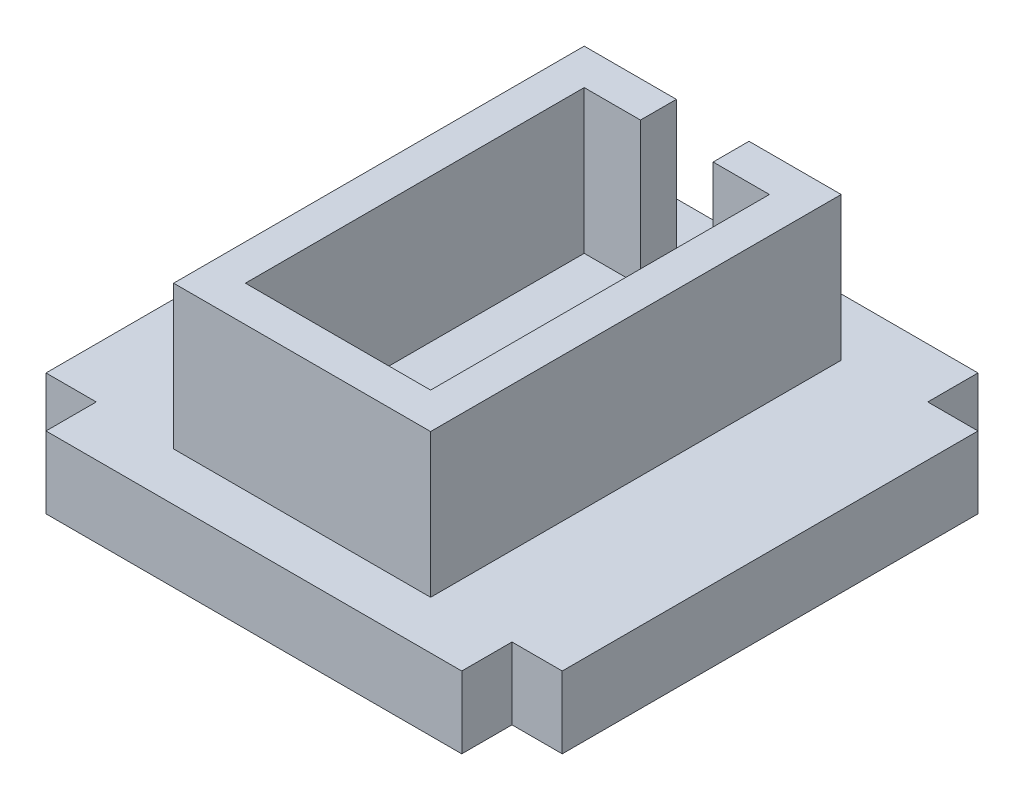
ISO-10303-21;
HEADER;
FILE_DESCRIPTION(('STEP AP214'),'2;1');
FILE_NAME('part.step','',(''),(''),'','','');
FILE_SCHEMA(('AUTOMOTIVE_DESIGN { 1 0 10303 214 1 1 1 1 }'));
ENDSEC;
DATA;
#1=APPLICATION_CONTEXT('core data for automotive mechanical design processes');
#2=APPLICATION_PROTOCOL_DEFINITION('international standard','automotive_design',2000,#1);
#3=PRODUCT_CONTEXT('',#1,'mechanical');
#4=PRODUCT('Part','Part','',(#3));
#5=PRODUCT_RELATED_PRODUCT_CATEGORY('part','',(#4));
#6=PRODUCT_DEFINITION_FORMATION('','',#4);
#7=PRODUCT_DEFINITION_CONTEXT('part definition',#1,'design');
#8=PRODUCT_DEFINITION('design','',#6,#7);
#9=PRODUCT_DEFINITION_SHAPE('','',#8);
#10=(LENGTH_UNIT() NAMED_UNIT(*) SI_UNIT(.MILLI.,.METRE.));
#11=(NAMED_UNIT(*) PLANE_ANGLE_UNIT() SI_UNIT($,.RADIAN.));
#12=(NAMED_UNIT(*) SI_UNIT($,.STERADIAN.) SOLID_ANGLE_UNIT());
#13=UNCERTAINTY_MEASURE_WITH_UNIT(LENGTH_MEASURE(1.E-05),#10,'distance_accuracy_value','');
#14=(GEOMETRIC_REPRESENTATION_CONTEXT(3) GLOBAL_UNCERTAINTY_ASSIGNED_CONTEXT((#13)) GLOBAL_UNIT_ASSIGNED_CONTEXT((#10,
#11,#12)) REPRESENTATION_CONTEXT('',''));
#15=CARTESIAN_POINT('',(0.,0.,0.));
#16=DIRECTION('',(0.,0.,1.));
#17=DIRECTION('',(1.,0.,0.));
#18=AXIS2_PLACEMENT_3D('',#15,#16,#17);
#19=CARTESIAN_POINT('',(0.,5.,0.));
#20=DIRECTION('',(0.,1.,0.));
#21=DIRECTION('',(0.,0.,1.));
#22=AXIS2_PLACEMENT_3D('',#19,#20,#21);
#23=PLANE('',#22);
#24=DIRECTION('',(-1.,0.,0.));
#25=VECTOR('',#24,1.);
#26=CARTESIAN_POINT('',(14.48,5.,-17.98));
#27=LINE('',#26,#25);
#28=CARTESIAN_POINT('',(14.48,5.,-17.98));
#29=VERTEX_POINT('',#28);
#30=CARTESIAN_POINT('',(-14.48,5.,-17.98));
#31=VERTEX_POINT('',#30);
#32=EDGE_CURVE('E111',#29,#31,#27,.T.);
#33=ORIENTED_EDGE('',*,*,#32,.T.);
#34=DIRECTION('',(0.,0.,1.));
#35=VECTOR('',#34,1.);
#36=CARTESIAN_POINT('',(-14.48,5.,-17.98));
#37=LINE('',#36,#35);
#38=CARTESIAN_POINT('',(-14.48,5.,-14.48));
#39=VERTEX_POINT('',#38);
#40=EDGE_CURVE('E261',#31,#39,#37,.T.);
#41=ORIENTED_EDGE('',*,*,#40,.T.);
#42=DIRECTION('',(-1.,0.,0.));
#43=VECTOR('',#42,1.);
#44=CARTESIAN_POINT('',(-14.48,5.,-14.48));
#45=LINE('',#44,#43);
#46=CARTESIAN_POINT('',(-17.98,5.,-14.48));
#47=VERTEX_POINT('',#46);
#48=EDGE_CURVE('E222',#39,#47,#45,.T.);
#49=ORIENTED_EDGE('',*,*,#48,.T.);
#50=DIRECTION('',(0.,0.,1.));
#51=VECTOR('',#50,1.);
#52=CARTESIAN_POINT('',(-17.98,5.,0.));
#53=LINE('',#52,#51);
#54=CARTESIAN_POINT('',(-17.98,5.,14.48));
#55=VERTEX_POINT('',#54);
#56=EDGE_CURVE('E239',#47,#55,#53,.T.);
#57=ORIENTED_EDGE('',*,*,#56,.T.);
#58=DIRECTION('',(1.,0.,0.));
#59=VECTOR('',#58,1.);
#60=CARTESIAN_POINT('',(-17.98,5.,14.48));
#61=LINE('',#60,#59);
#62=CARTESIAN_POINT('',(-14.48,5.,14.48));
#63=VERTEX_POINT('',#62);
#64=EDGE_CURVE('E236',#55,#63,#61,.T.);
#65=ORIENTED_EDGE('',*,*,#64,.T.);
#66=DIRECTION('',(0.,0.,1.));
#67=VECTOR('',#66,1.);
#68=CARTESIAN_POINT('',(-14.48,5.,14.48));
#69=LINE('',#68,#67);
#70=CARTESIAN_POINT('',(-14.48,5.,17.98));
#71=VERTEX_POINT('',#70);
#72=EDGE_CURVE('E238',#63,#71,#69,.T.);
#73=ORIENTED_EDGE('',*,*,#72,.T.);
#74=DIRECTION('',(1.,0.,0.));
#75=VECTOR('',#74,1.);
#76=CARTESIAN_POINT('',(-14.48,5.,17.98));
#77=LINE('',#76,#75);
#78=CARTESIAN_POINT('',(14.48,5.,17.98));
#79=VERTEX_POINT('',#78);
#80=EDGE_CURVE('E241',#71,#79,#77,.T.);
#81=ORIENTED_EDGE('',*,*,#80,.T.);
#82=DIRECTION('',(0.,0.,-1.));
#83=VECTOR('',#82,1.);
#84=CARTESIAN_POINT('',(14.48,5.,17.98));
#85=LINE('',#84,#83);
#86=CARTESIAN_POINT('',(14.48,5.,14.48));
#87=VERTEX_POINT('',#86);
#88=EDGE_CURVE('E247',#79,#87,#85,.T.);
#89=ORIENTED_EDGE('',*,*,#88,.T.);
#90=DIRECTION('',(1.,0.,0.));
#91=VECTOR('',#90,1.);
#92=CARTESIAN_POINT('',(14.48,5.,14.48));
#93=LINE('',#92,#91);
#94=CARTESIAN_POINT('',(17.98,5.,14.48));
#95=VERTEX_POINT('',#94);
#96=EDGE_CURVE('E147',#87,#95,#93,.T.);
#97=ORIENTED_EDGE('',*,*,#96,.T.);
#98=DIRECTION('',(0.,0.,-1.));
#99=VECTOR('',#98,1.);
#100=CARTESIAN_POINT('',(17.98,5.,0.));
#101=LINE('',#100,#99);
#102=CARTESIAN_POINT('',(17.98,5.,-14.48));
#103=VERTEX_POINT('',#102);
#104=EDGE_CURVE('E140',#95,#103,#101,.T.);
#105=ORIENTED_EDGE('',*,*,#104,.T.);
#106=DIRECTION('',(-1.,0.,0.));
#107=VECTOR('',#106,1.);
#108=CARTESIAN_POINT('',(17.98,5.,-14.48));
#109=LINE('',#108,#107);
#110=CARTESIAN_POINT('',(14.48,5.,-14.48));
#111=VERTEX_POINT('',#110);
#112=EDGE_CURVE('E144',#103,#111,#109,.T.);
#113=ORIENTED_EDGE('',*,*,#112,.T.);
#114=DIRECTION('',(0.,0.,-1.));
#115=VECTOR('',#114,1.);
#116=CARTESIAN_POINT('',(14.48,5.,-14.48));
#117=LINE('',#116,#115);
#118=EDGE_CURVE('E60',#111,#29,#117,.T.);
#119=ORIENTED_EDGE('',*,*,#118,.T.);
#120=EDGE_LOOP('',(#33,#41,#49,#57,#65,#73,#81,#89,#97,#105,#113,#119));
#121=FACE_BOUND('',#120,.T.);
#122=DIRECTION('',(-1.,0.,0.));
#123=VECTOR('',#122,1.);
#124=CARTESIAN_POINT('',(2.53,5.,-13.98));
#125=LINE('',#124,#123);
#126=CARTESIAN_POINT('',(8.95,5.,-13.98));
#127=VERTEX_POINT('',#126);
#128=CARTESIAN_POINT('',(2.53,5.,-13.98));
#129=VERTEX_POINT('',#128);
#130=EDGE_CURVE('E608',#127,#129,#125,.T.);
#131=ORIENTED_EDGE('',*,*,#130,.F.);
#132=DIRECTION('',(0.,0.,-1.));
#133=VECTOR('',#132,1.);
#134=CARTESIAN_POINT('',(8.95,5.,-13.98));
#135=LINE('',#134,#133);
#136=CARTESIAN_POINT('',(8.95,5.,14.62));
#137=VERTEX_POINT('',#136);
#138=EDGE_CURVE('E545',#137,#127,#135,.T.);
#139=ORIENTED_EDGE('',*,*,#138,.F.);
#140=DIRECTION('',(1.,0.,0.));
#141=VECTOR('',#140,1.);
#142=CARTESIAN_POINT('',(-8.95,5.,14.62));
#143=LINE('',#142,#141);
#144=CARTESIAN_POINT('',(-8.95,5.,14.62));
#145=VERTEX_POINT('',#144);
#146=EDGE_CURVE('E539',#145,#137,#143,.T.);
#147=ORIENTED_EDGE('',*,*,#146,.F.);
#148=DIRECTION('',(0.,0.,1.));
#149=VECTOR('',#148,1.);
#150=CARTESIAN_POINT('',(-8.95,5.,-13.98));
#151=LINE('',#150,#149);
#152=CARTESIAN_POINT('',(-8.95,5.,-13.98));
#153=VERTEX_POINT('',#152);
#154=EDGE_CURVE('E583',#153,#145,#151,.T.);
#155=ORIENTED_EDGE('',*,*,#154,.F.);
#156=DIRECTION('',(-1.,0.,0.));
#157=VECTOR('',#156,1.);
#158=CARTESIAN_POINT('',(-8.95,5.,-13.98));
#159=LINE('',#158,#157);
#160=CARTESIAN_POINT('',(-2.53,5.,-13.98));
#161=VERTEX_POINT('',#160);
#162=EDGE_CURVE('E585',#161,#153,#159,.T.);
#163=ORIENTED_EDGE('',*,*,#162,.F.);
#164=DIRECTION('',(0.,0.,-1.));
#165=VECTOR('',#164,1.);
#166=CARTESIAN_POINT('',(-2.53,5.,-13.98));
#167=LINE('',#166,#165);
#168=CARTESIAN_POINT('',(-2.53,5.,-11.48));
#169=VERTEX_POINT('',#168);
#170=EDGE_CURVE('E588',#169,#161,#167,.T.);
#171=ORIENTED_EDGE('',*,*,#170,.F.);
#172=DIRECTION('',(1.,0.,0.));
#173=VECTOR('',#172,1.);
#174=CARTESIAN_POINT('',(-2.53,5.,-11.48));
#175=LINE('',#174,#173);
#176=CARTESIAN_POINT('',(-6.45,5.,-11.48));
#177=VERTEX_POINT('',#176);
#178=EDGE_CURVE('E591',#177,#169,#175,.T.);
#179=ORIENTED_EDGE('',*,*,#178,.F.);
#180=DIRECTION('',(0.,0.,-1.));
#181=VECTOR('',#180,1.);
#182=CARTESIAN_POINT('',(-6.45,5.,-11.48));
#183=LINE('',#182,#181);
#184=CARTESIAN_POINT('',(-6.45,5.,12.12));
#185=VERTEX_POINT('',#184);
#186=EDGE_CURVE('E594',#185,#177,#183,.T.);
#187=ORIENTED_EDGE('',*,*,#186,.F.);
#188=DIRECTION('',(-1.,0.,0.));
#189=VECTOR('',#188,1.);
#190=CARTESIAN_POINT('',(-6.45,5.,12.12));
#191=LINE('',#190,#189);
#192=CARTESIAN_POINT('',(6.45,5.,12.12));
#193=VERTEX_POINT('',#192);
#194=EDGE_CURVE('E597',#193,#185,#191,.T.);
#195=ORIENTED_EDGE('',*,*,#194,.F.);
#196=DIRECTION('',(0.,0.,1.));
#197=VECTOR('',#196,1.);
#198=CARTESIAN_POINT('',(6.45,5.,12.12));
#199=LINE('',#198,#197);
#200=CARTESIAN_POINT('',(6.45,5.,-11.48));
#201=VERTEX_POINT('',#200);
#202=EDGE_CURVE('E600',#201,#193,#199,.T.);
#203=ORIENTED_EDGE('',*,*,#202,.F.);
#204=DIRECTION('',(1.,0.,0.));
#205=VECTOR('',#204,1.);
#206=CARTESIAN_POINT('',(6.45,5.,-11.48));
#207=LINE('',#206,#205);
#208=CARTESIAN_POINT('',(2.53,5.,-11.48));
#209=VERTEX_POINT('',#208);
#210=EDGE_CURVE('E603',#209,#201,#207,.T.);
#211=ORIENTED_EDGE('',*,*,#210,.F.);
#212=DIRECTION('',(0.,0.,1.));
#213=VECTOR('',#212,1.);
#214=CARTESIAN_POINT('',(2.53,5.,-11.48));
#215=LINE('',#214,#213);
#216=EDGE_CURVE('E606',#129,#209,#215,.T.);
#217=ORIENTED_EDGE('',*,*,#216,.F.);
#218=EDGE_LOOP('',(#131,#139,#147,#155,#163,#171,#179,#187,#195,#203,#211,#217));
#219=FACE_BOUND('',#218,.T.);
#220=ADVANCED_FACE('F36',(#121,#219),#23,.T.);
#221=CARTESIAN_POINT('',(0.,5.,-17.98));
#222=DIRECTION('',(0.,0.,1.));
#223=DIRECTION('',(1.,0.,0.));
#224=AXIS2_PLACEMENT_3D('',#221,#222,#223);
#225=PLANE('',#224);
#226=DIRECTION('',(-1.,0.,0.));
#227=VECTOR('',#226,1.);
#228=CARTESIAN_POINT('',(0.,0.,-17.98));
#229=LINE('',#228,#227);
#230=CARTESIAN_POINT('',(14.48,0.,-17.98));
#231=VERTEX_POINT('',#230);
#232=CARTESIAN_POINT('',(-14.48,0.,-17.98));
#233=VERTEX_POINT('',#232);
#234=EDGE_CURVE('E105',#231,#233,#229,.T.);
#235=ORIENTED_EDGE('',*,*,#234,.T.);
#236=DIRECTION('',(0.,-1.,0.));
#237=VECTOR('',#236,1.);
#238=CARTESIAN_POINT('',(-14.48,5.,-17.98));
#239=LINE('',#238,#237);
#240=EDGE_CURVE('E11',#31,#233,#239,.T.);
#241=ORIENTED_EDGE('',*,*,#240,.F.);
#242=ORIENTED_EDGE('',*,*,#32,.F.);
#243=DIRECTION('',(0.,-1.,0.));
#244=VECTOR('',#243,1.);
#245=CARTESIAN_POINT('',(14.48,5.,-17.98));
#246=LINE('',#245,#244);
#247=EDGE_CURVE('E164',#29,#231,#246,.T.);
#248=ORIENTED_EDGE('',*,*,#247,.T.);
#249=EDGE_LOOP('',(#235,#241,#242,#248));
#250=FACE_BOUND('',#249,.T.);
#251=ADVANCED_FACE('F38',(#250),#225,.F.);
#252=CARTESIAN_POINT('',(-14.48,5.,-17.98));
#253=DIRECTION('',(1.,0.,0.));
#254=DIRECTION('',(0.,0.,-1.));
#255=AXIS2_PLACEMENT_3D('',#252,#253,#254);
#256=PLANE('',#255);
#257=DIRECTION('',(0.,0.,1.));
#258=VECTOR('',#257,1.);
#259=CARTESIAN_POINT('',(-14.48,0.,-17.98));
#260=LINE('',#259,#258);
#261=CARTESIAN_POINT('',(-14.48,0.,-14.48));
#262=VERTEX_POINT('',#261);
#263=EDGE_CURVE('E169',#233,#262,#260,.T.);
#264=ORIENTED_EDGE('',*,*,#263,.T.);
#265=DIRECTION('',(0.,-1.,0.));
#266=VECTOR('',#265,1.);
#267=CARTESIAN_POINT('',(-14.48,5.,-14.48));
#268=LINE('',#267,#266);
#269=EDGE_CURVE('E44',#39,#262,#268,.T.);
#270=ORIENTED_EDGE('',*,*,#269,.F.);
#271=ORIENTED_EDGE('',*,*,#40,.F.);
#272=ORIENTED_EDGE('',*,*,#240,.T.);
#273=EDGE_LOOP('',(#264,#270,#271,#272));
#274=FACE_BOUND('',#273,.T.);
#275=ADVANCED_FACE('F266',(#274),#256,.F.);
#276=CARTESIAN_POINT('',(-14.48,5.,-14.48));
#277=DIRECTION('',(0.,0.,1.));
#278=DIRECTION('',(1.,0.,0.));
#279=AXIS2_PLACEMENT_3D('',#276,#277,#278);
#280=PLANE('',#279);
#281=DIRECTION('',(-1.,0.,0.));
#282=VECTOR('',#281,1.);
#283=CARTESIAN_POINT('',(-14.48,0.,-14.48));
#284=LINE('',#283,#282);
#285=CARTESIAN_POINT('',(-17.98,0.,-14.48));
#286=VERTEX_POINT('',#285);
#287=EDGE_CURVE('E172',#262,#286,#284,.T.);
#288=ORIENTED_EDGE('',*,*,#287,.T.);
#289=DIRECTION('',(0.,-1.,0.));
#290=VECTOR('',#289,1.);
#291=CARTESIAN_POINT('',(-17.98,5.,-14.48));
#292=LINE('',#291,#290);
#293=EDGE_CURVE('E213',#47,#286,#292,.T.);
#294=ORIENTED_EDGE('',*,*,#293,.F.);
#295=ORIENTED_EDGE('',*,*,#48,.F.);
#296=ORIENTED_EDGE('',*,*,#269,.T.);
#297=EDGE_LOOP('',(#288,#294,#295,#296));
#298=FACE_BOUND('',#297,.T.);
#299=ADVANCED_FACE('F220',(#298),#280,.F.);
#300=CARTESIAN_POINT('',(-17.98,5.,14.48));
#301=DIRECTION('',(1.,0.,0.));
#302=DIRECTION('',(0.,0.,-1.));
#303=AXIS2_PLACEMENT_3D('',#300,#301,#302);
#304=PLANE('',#303);
#305=DIRECTION('',(0.,0.,1.));
#306=VECTOR('',#305,1.);
#307=CARTESIAN_POINT('',(-17.98,0.,14.48));
#308=LINE('',#307,#306);
#309=CARTESIAN_POINT('',(-17.98,0.,14.48));
#310=VERTEX_POINT('',#309);
#311=EDGE_CURVE('E175',#286,#310,#308,.T.);
#312=ORIENTED_EDGE('',*,*,#311,.T.);
#313=DIRECTION('',(0.,-1.,0.));
#314=VECTOR('',#313,1.);
#315=CARTESIAN_POINT('',(-17.98,5.,14.48));
#316=LINE('',#315,#314);
#317=EDGE_CURVE('E210',#55,#310,#316,.T.);
#318=ORIENTED_EDGE('',*,*,#317,.F.);
#319=ORIENTED_EDGE('',*,*,#56,.F.);
#320=ORIENTED_EDGE('',*,*,#293,.T.);
#321=EDGE_LOOP('',(#312,#318,#319,#320));
#322=FACE_BOUND('',#321,.T.);
#323=ADVANCED_FACE('F230',(#322),#304,.F.);
#324=CARTESIAN_POINT('',(-17.98,5.,14.48));
#325=DIRECTION('',(0.,0.,-1.));
#326=DIRECTION('',(-1.,0.,0.));
#327=AXIS2_PLACEMENT_3D('',#324,#325,#326);
#328=PLANE('',#327);
#329=DIRECTION('',(1.,0.,0.));
#330=VECTOR('',#329,1.);
#331=CARTESIAN_POINT('',(-17.98,0.,14.48));
#332=LINE('',#331,#330);
#333=CARTESIAN_POINT('',(-14.48,0.,14.48));
#334=VERTEX_POINT('',#333);
#335=EDGE_CURVE('E177',#310,#334,#332,.T.);
#336=ORIENTED_EDGE('',*,*,#335,.T.);
#337=DIRECTION('',(0.,-1.,0.));
#338=VECTOR('',#337,1.);
#339=CARTESIAN_POINT('',(-14.48,5.,14.48));
#340=LINE('',#339,#338);
#341=EDGE_CURVE('E207',#63,#334,#340,.T.);
#342=ORIENTED_EDGE('',*,*,#341,.F.);
#343=ORIENTED_EDGE('',*,*,#64,.F.);
#344=ORIENTED_EDGE('',*,*,#317,.T.);
#345=EDGE_LOOP('',(#336,#342,#343,#344));
#346=FACE_BOUND('',#345,.T.);
#347=ADVANCED_FACE('F234',(#346),#328,.F.);
#348=CARTESIAN_POINT('',(-14.48,5.,14.48));
#349=DIRECTION('',(1.,0.,0.));
#350=DIRECTION('',(0.,0.,-1.));
#351=AXIS2_PLACEMENT_3D('',#348,#349,#350);
#352=PLANE('',#351);
#353=DIRECTION('',(0.,0.,1.));
#354=VECTOR('',#353,1.);
#355=CARTESIAN_POINT('',(-14.48,0.,14.48));
#356=LINE('',#355,#354);
#357=CARTESIAN_POINT('',(-14.48,0.,17.98));
#358=VERTEX_POINT('',#357);
#359=EDGE_CURVE('E179',#334,#358,#356,.T.);
#360=ORIENTED_EDGE('',*,*,#359,.T.);
#361=DIRECTION('',(0.,-1.,0.));
#362=VECTOR('',#361,1.);
#363=CARTESIAN_POINT('',(-14.48,5.,17.98));
#364=LINE('',#363,#362);
#365=EDGE_CURVE('E204',#71,#358,#364,.T.);
#366=ORIENTED_EDGE('',*,*,#365,.F.);
#367=ORIENTED_EDGE('',*,*,#72,.F.);
#368=ORIENTED_EDGE('',*,*,#341,.T.);
#369=EDGE_LOOP('',(#360,#366,#367,#368));
#370=FACE_BOUND('',#369,.T.);
#371=ADVANCED_FACE('F296',(#370),#352,.F.);
#372=CARTESIAN_POINT('',(0.,5.,17.98));
#373=DIRECTION('',(0.,0.,-1.));
#374=DIRECTION('',(-1.,0.,0.));
#375=AXIS2_PLACEMENT_3D('',#372,#373,#374);
#376=PLANE('',#375);
#377=DIRECTION('',(1.,0.,0.));
#378=VECTOR('',#377,1.);
#379=CARTESIAN_POINT('',(0.,0.,17.98));
#380=LINE('',#379,#378);
#381=CARTESIAN_POINT('',(14.48,0.,17.98));
#382=VERTEX_POINT('',#381);
#383=EDGE_CURVE('E182',#358,#382,#380,.T.);
#384=ORIENTED_EDGE('',*,*,#383,.T.);
#385=DIRECTION('',(0.,-1.,0.));
#386=VECTOR('',#385,1.);
#387=CARTESIAN_POINT('',(14.48,5.,17.98));
#388=LINE('',#387,#386);
#389=EDGE_CURVE('E201',#79,#382,#388,.T.);
#390=ORIENTED_EDGE('',*,*,#389,.F.);
#391=ORIENTED_EDGE('',*,*,#80,.F.);
#392=ORIENTED_EDGE('',*,*,#365,.T.);
#393=EDGE_LOOP('',(#384,#390,#391,#392));
#394=FACE_BOUND('',#393,.T.);
#395=ADVANCED_FACE('F293',(#394),#376,.F.);
#396=CARTESIAN_POINT('',(14.48,5.,17.98));
#397=DIRECTION('',(-1.,0.,0.));
#398=DIRECTION('',(0.,0.,1.));
#399=AXIS2_PLACEMENT_3D('',#396,#397,#398);
#400=PLANE('',#399);
#401=DIRECTION('',(0.,0.,-1.));
#402=VECTOR('',#401,1.);
#403=CARTESIAN_POINT('',(14.48,0.,17.98));
#404=LINE('',#403,#402);
#405=CARTESIAN_POINT('',(14.48,0.,14.48));
#406=VERTEX_POINT('',#405);
#407=EDGE_CURVE('E184',#382,#406,#404,.T.);
#408=ORIENTED_EDGE('',*,*,#407,.T.);
#409=DIRECTION('',(0.,-1.,0.));
#410=VECTOR('',#409,1.);
#411=CARTESIAN_POINT('',(14.48,5.,14.48));
#412=LINE('',#411,#410);
#413=EDGE_CURVE('E198',#87,#406,#412,.T.);
#414=ORIENTED_EDGE('',*,*,#413,.F.);
#415=ORIENTED_EDGE('',*,*,#88,.F.);
#416=ORIENTED_EDGE('',*,*,#389,.T.);
#417=EDGE_LOOP('',(#408,#414,#415,#416));
#418=FACE_BOUND('',#417,.T.);
#419=ADVANCED_FACE('F253',(#418),#400,.F.);
#420=CARTESIAN_POINT('',(14.48,5.,14.48));
#421=DIRECTION('',(0.,0.,-1.));
#422=DIRECTION('',(-1.,0.,0.));
#423=AXIS2_PLACEMENT_3D('',#420,#421,#422);
#424=PLANE('',#423);
#425=DIRECTION('',(1.,0.,0.));
#426=VECTOR('',#425,1.);
#427=CARTESIAN_POINT('',(14.48,0.,14.48));
#428=LINE('',#427,#426);
#429=CARTESIAN_POINT('',(17.98,0.,14.48));
#430=VERTEX_POINT('',#429);
#431=EDGE_CURVE('E186',#406,#430,#428,.T.);
#432=ORIENTED_EDGE('',*,*,#431,.T.);
#433=DIRECTION('',(0.,-1.,0.));
#434=VECTOR('',#433,1.);
#435=CARTESIAN_POINT('',(17.98,5.,14.48));
#436=LINE('',#435,#434);
#437=EDGE_CURVE('E158',#95,#430,#436,.T.);
#438=ORIENTED_EDGE('',*,*,#437,.F.);
#439=ORIENTED_EDGE('',*,*,#96,.F.);
#440=ORIENTED_EDGE('',*,*,#413,.T.);
#441=EDGE_LOOP('',(#432,#438,#439,#440));
#442=FACE_BOUND('',#441,.T.);
#443=ADVANCED_FACE('F257',(#442),#424,.F.);
#444=CARTESIAN_POINT('',(17.98,5.,0.));
#445=DIRECTION('',(-1.,0.,0.));
#446=DIRECTION('',(0.,0.,1.));
#447=AXIS2_PLACEMENT_3D('',#444,#445,#446);
#448=PLANE('',#447);
#449=DIRECTION('',(0.,0.,-1.));
#450=VECTOR('',#449,1.);
#451=CARTESIAN_POINT('',(17.98,0.,0.));
#452=LINE('',#451,#450);
#453=CARTESIAN_POINT('',(17.98,0.,-14.48));
#454=VERTEX_POINT('',#453);
#455=EDGE_CURVE('E155',#430,#454,#452,.T.);
#456=ORIENTED_EDGE('',*,*,#455,.T.);
#457=DIRECTION('',(0.,-1.,0.));
#458=VECTOR('',#457,1.);
#459=CARTESIAN_POINT('',(17.98,5.,-14.48));
#460=LINE('',#459,#458);
#461=EDGE_CURVE('E153',#103,#454,#460,.T.);
#462=ORIENTED_EDGE('',*,*,#461,.F.);
#463=ORIENTED_EDGE('',*,*,#104,.F.);
#464=ORIENTED_EDGE('',*,*,#437,.T.);
#465=EDGE_LOOP('',(#456,#462,#463,#464));
#466=FACE_BOUND('',#465,.T.);
#467=ADVANCED_FACE('F154',(#466),#448,.F.);
#468=CARTESIAN_POINT('',(17.98,5.,-14.48));
#469=DIRECTION('',(0.,0.,1.));
#470=DIRECTION('',(1.,0.,0.));
#471=AXIS2_PLACEMENT_3D('',#468,#469,#470);
#472=PLANE('',#471);
#473=DIRECTION('',(-1.,0.,0.));
#474=VECTOR('',#473,1.);
#475=CARTESIAN_POINT('',(17.98,0.,-14.48));
#476=LINE('',#475,#474);
#477=CARTESIAN_POINT('',(14.48,0.,-14.48));
#478=VERTEX_POINT('',#477);
#479=EDGE_CURVE('E190',#454,#478,#476,.T.);
#480=ORIENTED_EDGE('',*,*,#479,.T.);
#481=DIRECTION('',(0.,-1.,0.));
#482=VECTOR('',#481,1.);
#483=CARTESIAN_POINT('',(14.48,5.,-14.48));
#484=LINE('',#483,#482);
#485=EDGE_CURVE('E159',#111,#478,#484,.T.);
#486=ORIENTED_EDGE('',*,*,#485,.F.);
#487=ORIENTED_EDGE('',*,*,#112,.F.);
#488=ORIENTED_EDGE('',*,*,#461,.T.);
#489=EDGE_LOOP('',(#480,#486,#487,#488));
#490=FACE_BOUND('',#489,.T.);
#491=ADVANCED_FACE('F161',(#490),#472,.F.);
#492=CARTESIAN_POINT('',(14.48,5.,-14.48));
#493=DIRECTION('',(-1.,0.,0.));
#494=DIRECTION('',(0.,0.,1.));
#495=AXIS2_PLACEMENT_3D('',#492,#493,#494);
#496=PLANE('',#495);
#497=DIRECTION('',(0.,0.,-1.));
#498=VECTOR('',#497,1.);
#499=CARTESIAN_POINT('',(14.48,0.,-14.48));
#500=LINE('',#499,#498);
#501=EDGE_CURVE('E192',#478,#231,#500,.T.);
#502=ORIENTED_EDGE('',*,*,#501,.T.);
#503=ORIENTED_EDGE('',*,*,#247,.F.);
#504=ORIENTED_EDGE('',*,*,#118,.F.);
#505=ORIENTED_EDGE('',*,*,#485,.T.);
#506=EDGE_LOOP('',(#502,#503,#504,#505));
#507=FACE_BOUND('',#506,.T.);
#508=ADVANCED_FACE('F259',(#507),#496,.F.);
#509=CARTESIAN_POINT('',(0.,0.,0.));
#510=DIRECTION('',(0.,1.,0.));
#511=DIRECTION('',(0.,0.,1.));
#512=AXIS2_PLACEMENT_3D('',#509,#510,#511);
#513=PLANE('',#512);
#514=ORIENTED_EDGE('',*,*,#234,.F.);
#515=ORIENTED_EDGE('',*,*,#501,.F.);
#516=ORIENTED_EDGE('',*,*,#479,.F.);
#517=ORIENTED_EDGE('',*,*,#455,.F.);
#518=ORIENTED_EDGE('',*,*,#431,.F.);
#519=ORIENTED_EDGE('',*,*,#407,.F.);
#520=ORIENTED_EDGE('',*,*,#383,.F.);
#521=ORIENTED_EDGE('',*,*,#359,.F.);
#522=ORIENTED_EDGE('',*,*,#335,.F.);
#523=ORIENTED_EDGE('',*,*,#311,.F.);
#524=ORIENTED_EDGE('',*,*,#287,.F.);
#525=ORIENTED_EDGE('',*,*,#263,.F.);
#526=EDGE_LOOP('',(#514,#515,#516,#517,#518,#519,#520,#521,#522,#523,#524,#525));
#527=FACE_BOUND('',#526,.T.);
#528=ADVANCED_FACE('F225',(#527),#513,.F.);
#529=CARTESIAN_POINT('',(8.95,15.,-13.98));
#530=DIRECTION('',(-1.,0.,0.));
#531=DIRECTION('',(0.,0.,1.));
#532=AXIS2_PLACEMENT_3D('',#529,#530,#531);
#533=PLANE('',#532);
#534=ORIENTED_EDGE('',*,*,#138,.T.);
#535=DIRECTION('',(0.,-1.,0.));
#536=VECTOR('',#535,1.);
#537=CARTESIAN_POINT('',(8.95,15.,-13.98));
#538=LINE('',#537,#536);
#539=CARTESIAN_POINT('',(8.95,15.,-13.98));
#540=VERTEX_POINT('',#539);
#541=EDGE_CURVE('E170',#540,#127,#538,.T.);
#542=ORIENTED_EDGE('',*,*,#541,.F.);
#543=DIRECTION('',(0.,0.,-1.));
#544=VECTOR('',#543,1.);
#545=CARTESIAN_POINT('',(8.95,15.,-13.98));
#546=LINE('',#545,#544);
#547=CARTESIAN_POINT('',(8.95,15.,14.62));
#548=VERTEX_POINT('',#547);
#549=EDGE_CURVE('E527',#548,#540,#546,.T.);
#550=ORIENTED_EDGE('',*,*,#549,.F.);
#551=DIRECTION('',(0.,-1.,0.));
#552=VECTOR('',#551,1.);
#553=CARTESIAN_POINT('',(8.95,15.,14.62));
#554=LINE('',#553,#552);
#555=EDGE_CURVE('E580',#548,#137,#554,.T.);
#556=ORIENTED_EDGE('',*,*,#555,.T.);
#557=EDGE_LOOP('',(#534,#542,#550,#556));
#558=FACE_BOUND('',#557,.T.);
#559=ADVANCED_FACE('F279',(#558),#533,.F.);
#560=CARTESIAN_POINT('',(2.53,15.,-13.98));
#561=DIRECTION('',(0.,0.,1.));
#562=DIRECTION('',(1.,0.,0.));
#563=AXIS2_PLACEMENT_3D('',#560,#561,#562);
#564=PLANE('',#563);
#565=ORIENTED_EDGE('',*,*,#130,.T.);
#566=DIRECTION('',(0.,-1.,0.));
#567=VECTOR('',#566,1.);
#568=CARTESIAN_POINT('',(2.53,15.,-13.98));
#569=LINE('',#568,#567);
#570=CARTESIAN_POINT('',(2.53,15.,-13.98));
#571=VERTEX_POINT('',#570);
#572=EDGE_CURVE('E548',#571,#129,#569,.T.);
#573=ORIENTED_EDGE('',*,*,#572,.F.);
#574=DIRECTION('',(-1.,0.,0.));
#575=VECTOR('',#574,1.);
#576=CARTESIAN_POINT('',(2.53,15.,-13.98));
#577=LINE('',#576,#575);
#578=EDGE_CURVE('E532',#540,#571,#577,.T.);
#579=ORIENTED_EDGE('',*,*,#578,.F.);
#580=ORIENTED_EDGE('',*,*,#541,.T.);
#581=EDGE_LOOP('',(#565,#573,#579,#580));
#582=FACE_BOUND('',#581,.T.);
#583=ADVANCED_FACE('F350',(#582),#564,.F.);
#584=CARTESIAN_POINT('',(2.53,15.,-11.48));
#585=DIRECTION('',(1.,0.,0.));
#586=DIRECTION('',(0.,0.,-1.));
#587=AXIS2_PLACEMENT_3D('',#584,#585,#586);
#588=PLANE('',#587);
#589=ORIENTED_EDGE('',*,*,#216,.T.);
#590=DIRECTION('',(0.,-1.,0.));
#591=VECTOR('',#590,1.);
#592=CARTESIAN_POINT('',(2.53,15.,-11.48));
#593=LINE('',#592,#591);
#594=CARTESIAN_POINT('',(2.53,15.,-11.48));
#595=VERTEX_POINT('',#594);
#596=EDGE_CURVE('E550',#595,#209,#593,.T.);
#597=ORIENTED_EDGE('',*,*,#596,.F.);
#598=DIRECTION('',(0.,0.,1.));
#599=VECTOR('',#598,1.);
#600=CARTESIAN_POINT('',(2.53,15.,-11.48));
#601=LINE('',#600,#599);
#602=EDGE_CURVE('E635',#571,#595,#601,.T.);
#603=ORIENTED_EDGE('',*,*,#602,.F.);
#604=ORIENTED_EDGE('',*,*,#572,.T.);
#605=EDGE_LOOP('',(#589,#597,#603,#604));
#606=FACE_BOUND('',#605,.T.);
#607=ADVANCED_FACE('F357',(#606),#588,.F.);
#608=CARTESIAN_POINT('',(6.45,15.,-11.48));
#609=DIRECTION('',(0.,0.,-1.));
#610=DIRECTION('',(-1.,0.,0.));
#611=AXIS2_PLACEMENT_3D('',#608,#609,#610);
#612=PLANE('',#611);
#613=ORIENTED_EDGE('',*,*,#210,.T.);
#614=DIRECTION('',(0.,-1.,0.));
#615=VECTOR('',#614,1.);
#616=CARTESIAN_POINT('',(6.45,15.,-11.48));
#617=LINE('',#616,#615);
#618=CARTESIAN_POINT('',(6.45,15.,-11.48));
#619=VERTEX_POINT('',#618);
#620=EDGE_CURVE('E556',#619,#201,#617,.T.);
#621=ORIENTED_EDGE('',*,*,#620,.F.);
#622=DIRECTION('',(1.,0.,0.));
#623=VECTOR('',#622,1.);
#624=CARTESIAN_POINT('',(6.45,15.,-11.48));
#625=LINE('',#624,#623);
#626=EDGE_CURVE('E632',#595,#619,#625,.T.);
#627=ORIENTED_EDGE('',*,*,#626,.F.);
#628=ORIENTED_EDGE('',*,*,#596,.T.);
#629=EDGE_LOOP('',(#613,#621,#627,#628));
#630=FACE_BOUND('',#629,.T.);
#631=ADVANCED_FACE('F364',(#630),#612,.F.);
#632=CARTESIAN_POINT('',(6.45,15.,12.12));
#633=DIRECTION('',(1.,0.,0.));
#634=DIRECTION('',(0.,0.,-1.));
#635=AXIS2_PLACEMENT_3D('',#632,#633,#634);
#636=PLANE('',#635);
#637=ORIENTED_EDGE('',*,*,#202,.T.);
#638=DIRECTION('',(0.,-1.,0.));
#639=VECTOR('',#638,1.);
#640=CARTESIAN_POINT('',(6.45,15.,12.12));
#641=LINE('',#640,#639);
#642=CARTESIAN_POINT('',(6.45,15.,12.12));
#643=VERTEX_POINT('',#642);
#644=EDGE_CURVE('E561',#643,#193,#641,.T.);
#645=ORIENTED_EDGE('',*,*,#644,.F.);
#646=DIRECTION('',(0.,0.,1.));
#647=VECTOR('',#646,1.);
#648=CARTESIAN_POINT('',(6.45,15.,12.12));
#649=LINE('',#648,#647);
#650=EDGE_CURVE('E629',#619,#643,#649,.T.);
#651=ORIENTED_EDGE('',*,*,#650,.F.);
#652=ORIENTED_EDGE('',*,*,#620,.T.);
#653=EDGE_LOOP('',(#637,#645,#651,#652));
#654=FACE_BOUND('',#653,.T.);
#655=ADVANCED_FACE('F372',(#654),#636,.F.);
#656=CARTESIAN_POINT('',(-6.45,15.,12.12));
#657=DIRECTION('',(0.,0.,1.));
#658=DIRECTION('',(1.,0.,0.));
#659=AXIS2_PLACEMENT_3D('',#656,#657,#658);
#660=PLANE('',#659);
#661=ORIENTED_EDGE('',*,*,#194,.T.);
#662=DIRECTION('',(0.,-1.,0.));
#663=VECTOR('',#662,1.);
#664=CARTESIAN_POINT('',(-6.45,15.,12.12));
#665=LINE('',#664,#663);
#666=CARTESIAN_POINT('',(-6.45,15.,12.12));
#667=VERTEX_POINT('',#666);
#668=EDGE_CURVE('E564',#667,#185,#665,.T.);
#669=ORIENTED_EDGE('',*,*,#668,.F.);
#670=DIRECTION('',(-1.,0.,0.));
#671=VECTOR('',#670,1.);
#672=CARTESIAN_POINT('',(-6.45,15.,12.12));
#673=LINE('',#672,#671);
#674=EDGE_CURVE('E626',#643,#667,#673,.T.);
#675=ORIENTED_EDGE('',*,*,#674,.F.);
#676=ORIENTED_EDGE('',*,*,#644,.T.);
#677=EDGE_LOOP('',(#661,#669,#675,#676));
#678=FACE_BOUND('',#677,.T.);
#679=ADVANCED_FACE('F380',(#678),#660,.F.);
#680=CARTESIAN_POINT('',(-6.45,15.,-11.48));
#681=DIRECTION('',(-1.,0.,0.));
#682=DIRECTION('',(0.,0.,1.));
#683=AXIS2_PLACEMENT_3D('',#680,#681,#682);
#684=PLANE('',#683);
#685=ORIENTED_EDGE('',*,*,#186,.T.);
#686=DIRECTION('',(0.,-1.,0.));
#687=VECTOR('',#686,1.);
#688=CARTESIAN_POINT('',(-6.45,15.,-11.48));
#689=LINE('',#688,#687);
#690=CARTESIAN_POINT('',(-6.45,15.,-11.48));
#691=VERTEX_POINT('',#690);
#692=EDGE_CURVE('E567',#691,#177,#689,.T.);
#693=ORIENTED_EDGE('',*,*,#692,.F.);
#694=DIRECTION('',(0.,0.,-1.));
#695=VECTOR('',#694,1.);
#696=CARTESIAN_POINT('',(-6.45,15.,-11.48));
#697=LINE('',#696,#695);
#698=EDGE_CURVE('E623',#667,#691,#697,.T.);
#699=ORIENTED_EDGE('',*,*,#698,.F.);
#700=ORIENTED_EDGE('',*,*,#668,.T.);
#701=EDGE_LOOP('',(#685,#693,#699,#700));
#702=FACE_BOUND('',#701,.T.);
#703=ADVANCED_FACE('F388',(#702),#684,.F.);
#704=CARTESIAN_POINT('',(-2.53,15.,-11.48));
#705=DIRECTION('',(0.,0.,-1.));
#706=DIRECTION('',(-1.,0.,0.));
#707=AXIS2_PLACEMENT_3D('',#704,#705,#706);
#708=PLANE('',#707);
#709=ORIENTED_EDGE('',*,*,#178,.T.);
#710=DIRECTION('',(0.,-1.,0.));
#711=VECTOR('',#710,1.);
#712=CARTESIAN_POINT('',(-2.53,15.,-11.48));
#713=LINE('',#712,#711);
#714=CARTESIAN_POINT('',(-2.53,15.,-11.48));
#715=VERTEX_POINT('',#714);
#716=EDGE_CURVE('E570',#715,#169,#713,.T.);
#717=ORIENTED_EDGE('',*,*,#716,.F.);
#718=DIRECTION('',(1.,0.,0.));
#719=VECTOR('',#718,1.);
#720=CARTESIAN_POINT('',(-2.53,15.,-11.48));
#721=LINE('',#720,#719);
#722=EDGE_CURVE('E620',#691,#715,#721,.T.);
#723=ORIENTED_EDGE('',*,*,#722,.F.);
#724=ORIENTED_EDGE('',*,*,#692,.T.);
#725=EDGE_LOOP('',(#709,#717,#723,#724));
#726=FACE_BOUND('',#725,.T.);
#727=ADVANCED_FACE('F396',(#726),#708,.F.);
#728=CARTESIAN_POINT('',(-2.53,15.,-13.98));
#729=DIRECTION('',(-1.,0.,0.));
#730=DIRECTION('',(0.,0.,1.));
#731=AXIS2_PLACEMENT_3D('',#728,#729,#730);
#732=PLANE('',#731);
#733=ORIENTED_EDGE('',*,*,#170,.T.);
#734=DIRECTION('',(0.,-1.,0.));
#735=VECTOR('',#734,1.);
#736=CARTESIAN_POINT('',(-2.53,15.,-13.98));
#737=LINE('',#736,#735);
#738=CARTESIAN_POINT('',(-2.53,15.,-13.98));
#739=VERTEX_POINT('',#738);
#740=EDGE_CURVE('E573',#739,#161,#737,.T.);
#741=ORIENTED_EDGE('',*,*,#740,.F.);
#742=DIRECTION('',(0.,0.,-1.));
#743=VECTOR('',#742,1.);
#744=CARTESIAN_POINT('',(-2.53,15.,-13.98));
#745=LINE('',#744,#743);
#746=EDGE_CURVE('E617',#715,#739,#745,.T.);
#747=ORIENTED_EDGE('',*,*,#746,.F.);
#748=ORIENTED_EDGE('',*,*,#716,.T.);
#749=EDGE_LOOP('',(#733,#741,#747,#748));
#750=FACE_BOUND('',#749,.T.);
#751=ADVANCED_FACE('F404',(#750),#732,.F.);
#752=CARTESIAN_POINT('',(-8.95,15.,-13.98));
#753=DIRECTION('',(0.,0.,1.));
#754=DIRECTION('',(1.,0.,0.));
#755=AXIS2_PLACEMENT_3D('',#752,#753,#754);
#756=PLANE('',#755);
#757=ORIENTED_EDGE('',*,*,#162,.T.);
#758=DIRECTION('',(0.,-1.,0.));
#759=VECTOR('',#758,1.);
#760=CARTESIAN_POINT('',(-8.95,15.,-13.98));
#761=LINE('',#760,#759);
#762=CARTESIAN_POINT('',(-8.95,15.,-13.98));
#763=VERTEX_POINT('',#762);
#764=EDGE_CURVE('E576',#763,#153,#761,.T.);
#765=ORIENTED_EDGE('',*,*,#764,.F.);
#766=DIRECTION('',(-1.,0.,0.));
#767=VECTOR('',#766,1.);
#768=CARTESIAN_POINT('',(-8.95,15.,-13.98));
#769=LINE('',#768,#767);
#770=EDGE_CURVE('E614',#739,#763,#769,.T.);
#771=ORIENTED_EDGE('',*,*,#770,.F.);
#772=ORIENTED_EDGE('',*,*,#740,.T.);
#773=EDGE_LOOP('',(#757,#765,#771,#772));
#774=FACE_BOUND('',#773,.T.);
#775=ADVANCED_FACE('F412',(#774),#756,.F.);
#776=CARTESIAN_POINT('',(-8.95,15.,-13.98));
#777=DIRECTION('',(1.,0.,0.));
#778=DIRECTION('',(0.,0.,-1.));
#779=AXIS2_PLACEMENT_3D('',#776,#777,#778);
#780=PLANE('',#779);
#781=ORIENTED_EDGE('',*,*,#154,.T.);
#782=DIRECTION('',(0.,-1.,0.));
#783=VECTOR('',#782,1.);
#784=CARTESIAN_POINT('',(-8.95,15.,14.62));
#785=LINE('',#784,#783);
#786=CARTESIAN_POINT('',(-8.95,15.,14.62));
#787=VERTEX_POINT('',#786);
#788=EDGE_CURVE('E51',#787,#145,#785,.T.);
#789=ORIENTED_EDGE('',*,*,#788,.F.);
#790=DIRECTION('',(0.,0.,1.));
#791=VECTOR('',#790,1.);
#792=CARTESIAN_POINT('',(-8.95,15.,-13.98));
#793=LINE('',#792,#791);
#794=EDGE_CURVE('E612',#763,#787,#793,.T.);
#795=ORIENTED_EDGE('',*,*,#794,.F.);
#796=ORIENTED_EDGE('',*,*,#764,.T.);
#797=EDGE_LOOP('',(#781,#789,#795,#796));
#798=FACE_BOUND('',#797,.T.);
#799=ADVANCED_FACE('F420',(#798),#780,.F.);
#800=CARTESIAN_POINT('',(-8.95,15.,14.62));
#801=DIRECTION('',(0.,0.,-1.));
#802=DIRECTION('',(-1.,0.,0.));
#803=AXIS2_PLACEMENT_3D('',#800,#801,#802);
#804=PLANE('',#803);
#805=ORIENTED_EDGE('',*,*,#146,.T.);
#806=ORIENTED_EDGE('',*,*,#555,.F.);
#807=DIRECTION('',(1.,0.,0.));
#808=VECTOR('',#807,1.);
#809=CARTESIAN_POINT('',(-8.95,15.,14.62));
#810=LINE('',#809,#808);
#811=EDGE_CURVE('E535',#787,#548,#810,.T.);
#812=ORIENTED_EDGE('',*,*,#811,.F.);
#813=ORIENTED_EDGE('',*,*,#788,.T.);
#814=EDGE_LOOP('',(#805,#806,#812,#813));
#815=FACE_BOUND('',#814,.T.);
#816=ADVANCED_FACE('F428',(#815),#804,.F.);
#817=CARTESIAN_POINT('',(0.,15.,0.));
#818=DIRECTION('',(0.,1.,0.));
#819=DIRECTION('',(0.,0.,1.));
#820=AXIS2_PLACEMENT_3D('',#817,#818,#819);
#821=PLANE('',#820);
#822=ORIENTED_EDGE('',*,*,#549,.T.);
#823=ORIENTED_EDGE('',*,*,#578,.T.);
#824=ORIENTED_EDGE('',*,*,#602,.T.);
#825=ORIENTED_EDGE('',*,*,#626,.T.);
#826=ORIENTED_EDGE('',*,*,#650,.T.);
#827=ORIENTED_EDGE('',*,*,#674,.T.);
#828=ORIENTED_EDGE('',*,*,#698,.T.);
#829=ORIENTED_EDGE('',*,*,#722,.T.);
#830=ORIENTED_EDGE('',*,*,#746,.T.);
#831=ORIENTED_EDGE('',*,*,#770,.T.);
#832=ORIENTED_EDGE('',*,*,#794,.T.);
#833=ORIENTED_EDGE('',*,*,#811,.T.);
#834=EDGE_LOOP('',(#822,#823,#824,#825,#826,#827,#828,#829,#830,#831,#832,#833));
#835=FACE_BOUND('',#834,.T.);
#836=ADVANCED_FACE('F436',(#835),#821,.T.);
#837=CLOSED_SHELL('',(#220,#251,#275,#299,#323,#347,#371,#395,#419,#443,#467,#491,#508,#528,
#559,#583,#607,#631,#655,#679,#703,#727,#751,#775,#799,#816,#836));
#838=MANIFOLD_SOLID_BREP('B2',#837);
#839=ADVANCED_BREP_SHAPE_REPRESENTATION('',(#18,#838),#14);
#840=SHAPE_DEFINITION_REPRESENTATION(#9,#839);
ENDSEC;
END-ISO-10303-21;
